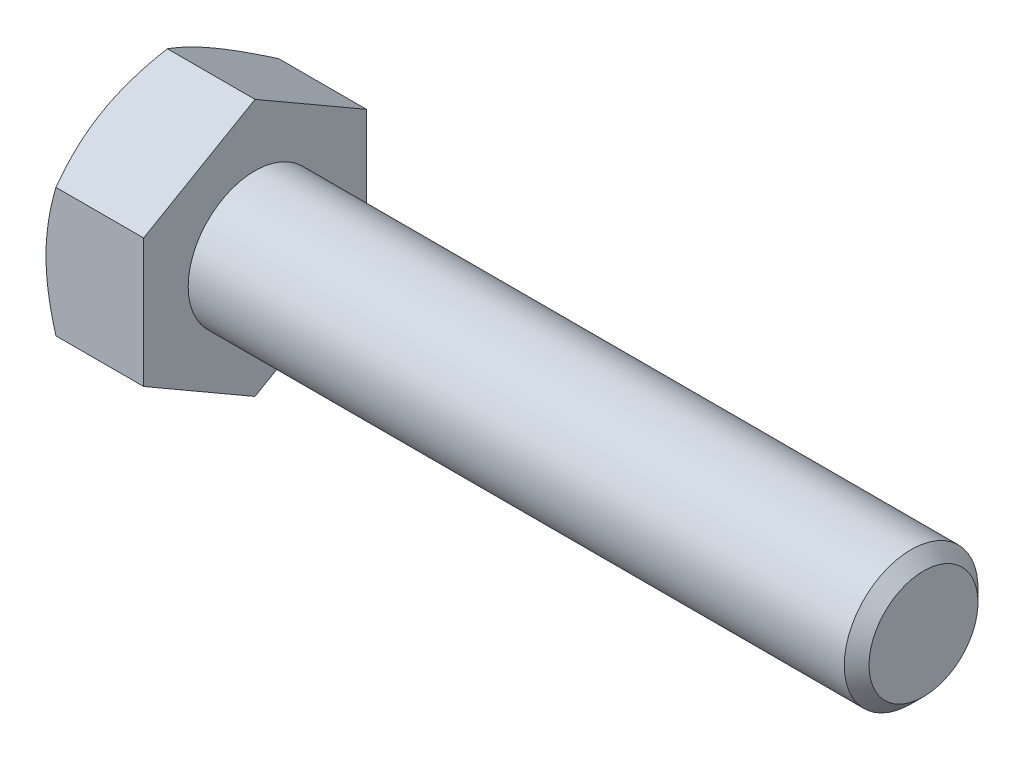
ISO-10303-21;
HEADER;
FILE_DESCRIPTION(('STEP AP214'),'2;1');
FILE_NAME('part.step','',(''),(''),'','','');
FILE_SCHEMA(('AUTOMOTIVE_DESIGN { 1 0 10303 214 1 1 1 1 }'));
ENDSEC;
DATA;
#1=APPLICATION_CONTEXT('core data for automotive mechanical design processes');
#2=APPLICATION_PROTOCOL_DEFINITION('international standard','automotive_design',2000,#1);
#3=PRODUCT_CONTEXT('',#1,'mechanical');
#4=PRODUCT('Part','Part','',(#3));
#5=PRODUCT_RELATED_PRODUCT_CATEGORY('part','',(#4));
#6=PRODUCT_DEFINITION_FORMATION('','',#4);
#7=PRODUCT_DEFINITION_CONTEXT('part definition',#1,'design');
#8=PRODUCT_DEFINITION('design','',#6,#7);
#9=PRODUCT_DEFINITION_SHAPE('','',#8);
#10=(LENGTH_UNIT() NAMED_UNIT(*) SI_UNIT(.MILLI.,.METRE.));
#11=(NAMED_UNIT(*) PLANE_ANGLE_UNIT() SI_UNIT($,.RADIAN.));
#12=(NAMED_UNIT(*) SI_UNIT($,.STERADIAN.) SOLID_ANGLE_UNIT());
#13=UNCERTAINTY_MEASURE_WITH_UNIT(LENGTH_MEASURE(1.E-05),#10,'distance_accuracy_value','');
#14=(GEOMETRIC_REPRESENTATION_CONTEXT(3) GLOBAL_UNCERTAINTY_ASSIGNED_CONTEXT((#13)) GLOBAL_UNIT_ASSIGNED_CONTEXT((#10,
#11,#12)) REPRESENTATION_CONTEXT('',''));
#15=CARTESIAN_POINT('',(0.,0.,0.));
#16=DIRECTION('',(0.,0.,1.));
#17=DIRECTION('',(1.,0.,0.));
#18=AXIS2_PLACEMENT_3D('',#15,#16,#17);
#19=CARTESIAN_POINT('',(0.,5.77350269189626,0.));
#20=DIRECTION('',(1.,0.,0.));
#21=DIRECTION('',(0.,0.,-1.));
#22=AXIS2_PLACEMENT_3D('',#19,#20,#21);
#23=PLANE('',#22);
#24=CARTESIAN_POINT('',(0.,0.,0.));
#25=DIRECTION('',(1.,0.,0.));
#26=DIRECTION('',(0.,1.,0.));
#27=AXIS2_PLACEMENT_3D('',#24,#25,#26);
#28=CIRCLE('',#27,4.99999999999545);
#29=CARTESIAN_POINT('',(1.31377912069731E-12,-4.33012701892023,-2.49999999999886));
#30=VERTEX_POINT('',#29);
#31=CARTESIAN_POINT('',(1.31276181687493E-12,0.,-4.99999999999773));
#32=VERTEX_POINT('',#31);
#33=EDGE_CURVE('E328',#30,#32,#28,.T.);
#34=ORIENTED_EDGE('',*,*,#33,.F.);
#35=CARTESIAN_POINT('',(0.,0.,0.));
#36=DIRECTION('',(1.,0.,0.));
#37=DIRECTION('',(0.,1.,0.));
#38=AXIS2_PLACEMENT_3D('',#35,#36,#37);
#39=CIRCLE('',#38,4.99999999999545);
#40=CARTESIAN_POINT('',(1.3112247506076E-12,-4.33012701892022,2.49999999999887));
#41=VERTEX_POINT('',#40);
#42=EDGE_CURVE('E327',#41,#30,#39,.T.);
#43=ORIENTED_EDGE('',*,*,#42,.F.);
#44=CARTESIAN_POINT('',(0.,0.,0.));
#45=DIRECTION('',(1.,0.,0.));
#46=DIRECTION('',(0.,1.,0.));
#47=AXIS2_PLACEMENT_3D('',#44,#45,#46);
#48=CIRCLE('',#47,4.99999999999545);
#49=CARTESIAN_POINT('',(1.31264503220733E-12,0.,4.99999999999773));
#50=VERTEX_POINT('',#49);
#51=EDGE_CURVE('E89',#50,#41,#48,.T.);
#52=ORIENTED_EDGE('',*,*,#51,.F.);
#53=CARTESIAN_POINT('',(0.,0.,0.));
#54=DIRECTION('',(1.,0.,0.));
#55=DIRECTION('',(0.,1.,0.));
#56=AXIS2_PLACEMENT_3D('',#53,#54,#55);
#57=CIRCLE('',#56,4.99999999999545);
#58=CARTESIAN_POINT('',(1.31333545798692E-12,4.33012701892022,2.49999999999887));
#59=VERTEX_POINT('',#58);
#60=EDGE_CURVE('E87',#59,#50,#57,.T.);
#61=ORIENTED_EDGE('',*,*,#60,.F.);
#62=CARTESIAN_POINT('',(0.,0.,0.));
#63=DIRECTION('',(1.,0.,0.));
#64=DIRECTION('',(0.,1.,0.));
#65=AXIS2_PLACEMENT_3D('',#62,#63,#64);
#66=CIRCLE('',#65,4.99999999999545);
#67=CARTESIAN_POINT('',(1.3127620276228E-12,4.33012701892022,-2.49999999999887));
#68=VERTEX_POINT('',#67);
#69=EDGE_CURVE('E20',#68,#59,#66,.T.);
#70=ORIENTED_EDGE('',*,*,#69,.F.);
#71=CARTESIAN_POINT('',(0.,0.,0.));
#72=DIRECTION('',(1.,0.,0.));
#73=DIRECTION('',(0.,1.,0.));
#74=AXIS2_PLACEMENT_3D('',#71,#72,#73);
#75=CIRCLE('',#74,4.99999999999545);
#76=EDGE_CURVE('E255',#32,#68,#75,.T.);
#77=ORIENTED_EDGE('',*,*,#76,.F.);
#78=EDGE_LOOP('',(#34,#43,#52,#61,#70,#77));
#79=FACE_BOUND('',#78,.T.);
#80=ADVANCED_FACE('F17',(#79),#23,.F.);
#81=CARTESIAN_POINT('',(0.449261479275265,0.,0.));
#82=DIRECTION('',(1.,0.,0.));
#83=DIRECTION('',(0.,1.,0.));
#84=AXIS2_PLACEMENT_3D('',#81,#82,#83);
#85=CONICAL_SURFACE('',#84,5.77814370797114,1.04719755118957);
#86=CARTESIAN_POINT('',(0.446581987394318,5.77350269189495,-2.27821175255341E-12));
#87=CARTESIAN_POINT('',(0.378731991613612,5.65601252710132,-0.203498934814473));
#88=CARTESIAN_POINT('',(0.316569549696801,5.53758145884731,-0.408627562225078));
#89=CARTESIAN_POINT('',(0.206947202600608,5.29967536418135,-0.820693005616809));
#90=CARTESIAN_POINT('',(0.159414596574626,5.18020863614853,-1.02761544838368));
#91=CARTESIAN_POINT('',(0.101052626368535,4.99988106812553,-1.33995195820484));
#92=CARTESIAN_POINT('',(0.0837477080387014,4.93954408647721,-1.44445867599509));
#93=CARTESIAN_POINT('',(0.0537925336807683,4.81858126545494,-1.65397242783251));
#94=CARTESIAN_POINT('',(0.0411421551416432,4.7579554337263,-1.75897944863763));
#95=CARTESIAN_POINT('',(0.0207183273002111,4.63619066509474,-1.96988221447936));
#96=CARTESIAN_POINT('',(0.0129696792605217,4.57505068020447,-2.0757797746833));
#97=CARTESIAN_POINT('',(0.00259979047148653,4.45265046787549,-2.28778316129432));
#98=CARTESIAN_POINT('',(-2.04348110579643E-05,4.39139021902687,-2.39388902478444));
#99=CARTESIAN_POINT('',(2.62566956059144E-12,4.33012701892219,-2.50000000000001));
#100=B_SPLINE_CURVE_WITH_KNOTS('',3,(#86,#87,#88,#89,#90,#91,#92,#93,#94,#95,#96,#97,#98,#99),
.UNSPECIFIED.,.F.,.F.,(4,2,2,2,2,2,4),(0.,0.734036658390386,1.46436443241443,1.83000749078048,
2.19564092445472,2.56310985866278,2.93065154716303),.UNSPECIFIED.);
#101=CARTESIAN_POINT('',(0.446581987394318,5.77350269189495,0.));
#102=VERTEX_POINT('',#101);
#103=EDGE_CURVE('E99',#102,#68,#100,.T.);
#104=ORIENTED_EDGE('',*,*,#103,.T.);
#105=ORIENTED_EDGE('',*,*,#69,.T.);
#106=CARTESIAN_POINT('',(2.62627457230914E-12,4.33012701892219,2.50000000000001));
#107=CARTESIAN_POINT('',(-2.04348110574818E-05,4.39139021902687,2.39388902478444));
#108=CARTESIAN_POINT('',(0.00259979047148711,4.45265046787549,2.28778316129432));
#109=CARTESIAN_POINT('',(0.0129696792605226,4.57505068020448,2.0757797746833));
#110=CARTESIAN_POINT('',(0.0207183273002123,4.63619066509475,1.96988221447936));
#111=CARTESIAN_POINT('',(0.0411421551416445,4.7579554337263,1.75897944863763));
#112=CARTESIAN_POINT('',(0.0537925336807697,4.81858126545494,1.65397242783251));
#113=CARTESIAN_POINT('',(0.0837477080387026,4.93954408647721,1.44445867599508));
#114=CARTESIAN_POINT('',(0.101052626368536,4.99988106812553,1.33995195820484));
#115=CARTESIAN_POINT('',(0.159414596574626,5.18020863614853,1.02761544838368));
#116=CARTESIAN_POINT('',(0.206947202600608,5.29967536418135,0.820693005616809));
#117=CARTESIAN_POINT('',(0.316569549696801,5.53758145884731,0.408627562225079));
#118=CARTESIAN_POINT('',(0.378731991613612,5.65601252710132,0.203498934814474));
#119=CARTESIAN_POINT('',(0.446581987394318,5.77350269189495,2.27899166758682E-12));
#120=B_SPLINE_CURVE_WITH_KNOTS('',3,(#106,#107,#108,#109,#110,#111,#112,#113,#114,#115,#116,
#117,#118,#119),.UNSPECIFIED.,.F.,.F.,(4,2,2,2,2,2,4),(0.,0.367541688500246,0.735010622708305,
1.10064405638255,1.4662871147486,2.19661488877264,2.93065154716302),.UNSPECIFIED.);
#121=EDGE_CURVE('E97',#59,#102,#120,.T.);
#122=ORIENTED_EDGE('',*,*,#121,.T.);
#123=EDGE_LOOP('',(#104,#105,#122));
#124=FACE_BOUND('',#123,.T.);
#125=ADVANCED_FACE('F95',(#124),#85,.T.);
#126=CARTESIAN_POINT('',(0.449261479275265,0.,0.));
#127=DIRECTION('',(1.,0.,0.));
#128=DIRECTION('',(0.,1.,0.));
#129=AXIS2_PLACEMENT_3D('',#126,#127,#128);
#130=CONICAL_SURFACE('',#129,5.77814370797114,1.04719755118957);
#131=CARTESIAN_POINT('',(0.446581987394315,2.88675134594944,4.99999999999772));
#132=CARTESIAN_POINT('',(0.378731991613609,3.00424151074306,4.79650106518553));
#133=CARTESIAN_POINT('',(0.316569549696799,3.12267257899707,4.59137243777492));
#134=CARTESIAN_POINT('',(0.206947202600606,3.36057867366303,4.1793069943832));
#135=CARTESIAN_POINT('',(0.159414596574625,3.48004540169586,3.97238455161633));
#136=CARTESIAN_POINT('',(0.101052626368535,3.66037296971886,3.66004804179516));
#137=CARTESIAN_POINT('',(0.0837477080387017,3.72070995136718,3.55554132400492));
#138=CARTESIAN_POINT('',(0.0537925336807689,3.84167277238944,3.3460275721675));
#139=CARTESIAN_POINT('',(0.0411421551416438,3.90229860411808,3.24102055136238));
#140=CARTESIAN_POINT('',(0.0207183273002118,4.02406337274964,3.03011778552065));
#141=CARTESIAN_POINT('',(0.0129696792605225,4.08520335763991,2.92422022531671));
#142=CARTESIAN_POINT('',(0.00259979047148732,4.20760356996889,2.71221683870569));
#143=CARTESIAN_POINT('',(-2.04348110572727E-05,4.26886381881751,2.60611097521557));
#144=CARTESIAN_POINT('',(2.62601554813398E-12,4.33012701892219,2.50000000000001));
#145=B_SPLINE_CURVE_WITH_KNOTS('',3,(#131,#132,#133,#134,#135,#136,#137,#138,#139,#140,#141,
#142,#143,#144),.UNSPECIFIED.,.F.,.F.,(4,2,2,2,2,2,4),(0.,0.734036658390382,1.46436443241442,
1.83000749078047,2.19564092445471,2.56310985866277,2.93065154716301),.UNSPECIFIED.);
#146=CARTESIAN_POINT('',(0.446581987394315,2.88675134594747,4.99999999999886));
#147=VERTEX_POINT('',#146);
#148=EDGE_CURVE('E102',#147,#59,#145,.T.);
#149=ORIENTED_EDGE('',*,*,#148,.T.);
#150=ORIENTED_EDGE('',*,*,#60,.T.);
#151=CARTESIAN_POINT('',(2.62529284589109E-12,0.,5.));
#152=CARTESIAN_POINT('',(-2.04348110587185E-05,0.122526400209358,5.));
#153=CARTESIAN_POINT('',(0.00259979047148596,0.245046897906593,5.));
#154=CARTESIAN_POINT('',(0.0129696792605216,0.489847322564566,5.));
#155=CARTESIAN_POINT('',(0.0207183273002114,0.612127292345108,5.));
#156=CARTESIAN_POINT('',(0.0411421551416433,0.855656829608219,5.));
#157=CARTESIAN_POINT('',(0.0537925336807679,0.976908493065498,5.));
#158=CARTESIAN_POINT('',(0.0837477080387005,1.21883413511003,5.));
#159=CARTESIAN_POINT('',(0.101052626368534,1.33950809840666,5.));
#160=CARTESIAN_POINT('',(0.159414596574625,1.70016323445266,5.));
#161=CARTESIAN_POINT('',(0.206947202600606,1.93909669051831,5.));
#162=CARTESIAN_POINT('',(0.316569549696798,2.41490887985023,5.));
#163=CARTESIAN_POINT('',(0.378731991613608,2.65177101635825,5.));
#164=CARTESIAN_POINT('',(0.446581987394315,2.88675134594549,5.));
#165=B_SPLINE_CURVE_WITH_KNOTS('',3,(#151,#152,#153,#154,#155,#156,#157,#158,#159,#160,#161,
#162,#163,#164),.UNSPECIFIED.,.F.,.F.,(4,2,2,2,2,2,4),(0.,0.367541688500244,0.735010622708302,
1.10064405638254,1.46628711474859,2.19661488877263,2.93065154716301),.UNSPECIFIED.);
#166=EDGE_CURVE('E105',#50,#147,#165,.T.);
#167=ORIENTED_EDGE('',*,*,#166,.T.);
#168=EDGE_LOOP('',(#149,#150,#167));
#169=FACE_BOUND('',#168,.T.);
#170=ADVANCED_FACE('F103',(#169),#130,.T.);
#171=CARTESIAN_POINT('',(0.449261479275265,0.,0.));
#172=DIRECTION('',(1.,0.,0.));
#173=DIRECTION('',(0.,1.,0.));
#174=AXIS2_PLACEMENT_3D('',#171,#172,#173);
#175=CONICAL_SURFACE('',#174,5.77814370797114,1.04719755118957);
#176=ORIENTED_EDGE('',*,*,#51,.T.);
#177=CARTESIAN_POINT('',(2.62242450390566E-12,-4.33012701892218,2.50000000000001));
#178=CARTESIAN_POINT('',(-2.04348110614389E-05,-4.2688638188175,2.60611097521557));
#179=CARTESIAN_POINT('',(0.00259979047148321,-4.20760356996889,2.71221683870569));
#180=CARTESIAN_POINT('',(0.0129696792605187,-4.0852033576399,2.92422022531671));
#181=CARTESIAN_POINT('',(0.0207183273002084,-4.02406337274963,3.03011778552065));
#182=CARTESIAN_POINT('',(0.0411421551416404,-3.90229860411807,3.24102055136238));
#183=CARTESIAN_POINT('',(0.0537925336807653,-3.84167277238943,3.3460275721675));
#184=CARTESIAN_POINT('',(0.0837477080386979,-3.72070995136717,3.55554132400492));
#185=CARTESIAN_POINT('',(0.101052626368531,-3.66037296971885,3.66004804179516));
#186=CARTESIAN_POINT('',(0.159414596574622,-3.48004540169585,3.97238455161633));
#187=CARTESIAN_POINT('',(0.206947202600603,-3.36057867366302,4.1793069943832));
#188=CARTESIAN_POINT('',(0.316569549696795,-3.12267257899706,4.59137243777492));
#189=CARTESIAN_POINT('',(0.378731991613605,-3.00424151074305,4.79650106518553));
#190=CARTESIAN_POINT('',(0.446581987394311,-2.88675134594943,4.99999999999772));
#191=B_SPLINE_CURVE_WITH_KNOTS('',3,(#177,#178,#179,#180,#181,#182,#183,#184,#185,#186,#187,
#188,#189,#190),.UNSPECIFIED.,.F.,.F.,(4,2,2,2,2,2,4),(0.,0.367541688500244,0.735010622708301,
1.10064405638254,1.46628711474859,2.19661488877263,2.93065154716301),.UNSPECIFIED.);
#192=CARTESIAN_POINT('',(0.446581987394311,-2.88675134594746,4.99999999999886));
#193=VERTEX_POINT('',#192);
#194=EDGE_CURVE('E174',#41,#193,#191,.T.);
#195=ORIENTED_EDGE('',*,*,#194,.T.);
#196=CARTESIAN_POINT('',(0.446581987394311,-2.88675134594548,5.));
#197=CARTESIAN_POINT('',(0.378731991613606,-2.65177101635824,5.));
#198=CARTESIAN_POINT('',(0.316569549696796,-2.41490887985022,5.));
#199=CARTESIAN_POINT('',(0.206947202600604,-1.93909669051831,5.));
#200=CARTESIAN_POINT('',(0.159414596574623,-1.70016323445266,5.));
#201=CARTESIAN_POINT('',(0.101052626368533,-1.33950809840666,5.));
#202=CARTESIAN_POINT('',(0.0837477080387002,-1.21883413511002,5.));
#203=CARTESIAN_POINT('',(0.0537925336807678,-0.976908493065495,5.));
#204=CARTESIAN_POINT('',(0.0411421551416427,-0.855656829608217,5.));
#205=CARTESIAN_POINT('',(0.0207183273002107,-0.612127292345106,5.));
#206=CARTESIAN_POINT('',(0.0129696792605213,-0.489847322564565,5.));
#207=CARTESIAN_POINT('',(0.00259979047148616,-0.245046897906593,5.));
#208=CARTESIAN_POINT('',(-2.04348110583341E-05,-0.122526400209359,5.));
#209=CARTESIAN_POINT('',(2.62529006441466E-12,0.,5.));
#210=B_SPLINE_CURVE_WITH_KNOTS('',3,(#196,#197,#198,#199,#200,#201,#202,#203,#204,#205,#206,
#207,#208,#209),.UNSPECIFIED.,.F.,.F.,(4,2,2,2,2,2,4),(0.,0.734036658390379,1.46436443241441,
1.83000749078047,2.1956409244547,2.56310985866276,2.930651547163),.UNSPECIFIED.);
#211=EDGE_CURVE('E148',#193,#50,#210,.T.);
#212=ORIENTED_EDGE('',*,*,#211,.T.);
#213=EDGE_LOOP('',(#176,#195,#212));
#214=FACE_BOUND('',#213,.T.);
#215=ADVANCED_FACE('F139',(#214),#175,.T.);
#216=CARTESIAN_POINT('',(0.449261479275265,0.,0.));
#217=DIRECTION('',(1.,0.,0.));
#218=DIRECTION('',(0.,1.,0.));
#219=AXIS2_PLACEMENT_3D('',#216,#217,#218);
#220=CONICAL_SURFACE('',#219,5.77814370797114,1.04719755118957);
#221=ORIENTED_EDGE('',*,*,#42,.T.);
#222=CARTESIAN_POINT('',(2.62692245925732E-12,-4.3301270189222,-2.5));
#223=CARTESIAN_POINT('',(-2.04348110562983E-05,-4.39139021902688,-2.39388902478443));
#224=CARTESIAN_POINT('',(0.00259979047148836,-4.45265046787549,-2.28778316129432));
#225=CARTESIAN_POINT('',(0.0129696792605236,-4.57505068020448,-2.07577977468329));
#226=CARTESIAN_POINT('',(0.020718327300213,-4.63619066509475,-1.96988221447935));
#227=CARTESIAN_POINT('',(0.0411421551416449,-4.75795543372631,-1.75897944863763));
#228=CARTESIAN_POINT('',(0.05379253368077,-4.81858126545495,-1.6539724278325));
#229=CARTESIAN_POINT('',(0.0837477080387027,-4.93954408647721,-1.44445867599508));
#230=CARTESIAN_POINT('',(0.101052626368536,-4.99988106812553,-1.33995195820484));
#231=CARTESIAN_POINT('',(0.159414596574626,-5.18020863614853,-1.02761544838367));
#232=CARTESIAN_POINT('',(0.206947202600608,-5.29967536418135,-0.820693005616806));
#233=CARTESIAN_POINT('',(0.3165695496968,-5.53758145884731,-0.408627562225077));
#234=CARTESIAN_POINT('',(0.37873199161361,-5.65601252710132,-0.203498934814473));
#235=CARTESIAN_POINT('',(0.446581987394316,-5.77350269189494,-2.2779459498124E-12));
#236=B_SPLINE_CURVE_WITH_KNOTS('',3,(#222,#223,#224,#225,#226,#227,#228,#229,#230,#231,#232,
#233,#234,#235),.UNSPECIFIED.,.F.,.F.,(4,2,2,2,2,2,4),(0.,0.367541688500244,0.735010622708302,
1.10064405638254,1.46628711474859,2.19661488877263,2.93065154716301),.UNSPECIFIED.);
#237=CARTESIAN_POINT('',(0.446581987394316,-5.77350269189494,0.));
#238=VERTEX_POINT('',#237);
#239=EDGE_CURVE('E302',#30,#238,#236,.T.);
#240=ORIENTED_EDGE('',*,*,#239,.T.);
#241=CARTESIAN_POINT('',(0.446581987394316,-5.77350269189494,2.27833276359788E-12));
#242=CARTESIAN_POINT('',(0.378731991613609,-5.65601252710132,0.203498934814475));
#243=CARTESIAN_POINT('',(0.316569549696798,-5.53758145884731,0.408627562225079));
#244=CARTESIAN_POINT('',(0.206947202600605,-5.29967536418135,0.820693005616809));
#245=CARTESIAN_POINT('',(0.159414596574624,-5.18020863614852,1.02761544838368));
#246=CARTESIAN_POINT('',(0.101052626368532,-4.99988106812552,1.33995195820485));
#247=CARTESIAN_POINT('',(0.0837477080386992,-4.9395440864772,1.44445867599509));
#248=CARTESIAN_POINT('',(0.0537925336807659,-4.81858126545494,1.65397242783251));
#249=CARTESIAN_POINT('',(0.0411421551416406,-4.7579554337263,1.75897944863763));
#250=CARTESIAN_POINT('',(0.0207183273002084,-4.63619066509474,1.96988221447936));
#251=CARTESIAN_POINT('',(0.0129696792605188,-4.57505068020447,2.0757797746833));
#252=CARTESIAN_POINT('',(0.00259979047148345,-4.45265046787548,2.28778316129433));
#253=CARTESIAN_POINT('',(-2.04348110611366E-05,-4.39139021902686,2.39388902478444));
#254=CARTESIAN_POINT('',(2.62242918875258E-12,-4.33012701892218,2.50000000000001));
#255=B_SPLINE_CURVE_WITH_KNOTS('',3,(#241,#242,#243,#244,#245,#246,#247,#248,#249,#250,#251,
#252,#253,#254),.UNSPECIFIED.,.F.,.F.,(4,2,2,2,2,2,4),(0.,0.734036658390386,1.46436443241443,
1.83000749078048,2.19564092445472,2.56310985866278,2.93065154716303),.UNSPECIFIED.);
#256=EDGE_CURVE('E169',#238,#41,#255,.T.);
#257=ORIENTED_EDGE('',*,*,#256,.T.);
#258=EDGE_LOOP('',(#221,#240,#257));
#259=FACE_BOUND('',#258,.T.);
#260=ADVANCED_FACE('F318',(#259),#220,.T.);
#261=CARTESIAN_POINT('',(0.449261479275265,0.,0.));
#262=DIRECTION('',(1.,0.,0.));
#263=DIRECTION('',(0.,1.,0.));
#264=AXIS2_PLACEMENT_3D('',#261,#262,#263);
#265=CONICAL_SURFACE('',#264,5.77814370797114,1.04719755118957);
#266=ORIENTED_EDGE('',*,*,#33,.T.);
#267=CARTESIAN_POINT('',(2.62554162158813E-12,0.,-5.));
#268=CARTESIAN_POINT('',(-2.04348110577706E-05,-0.122526400209367,-5.));
#269=CARTESIAN_POINT('',(0.00259979047148719,-0.24504689790661,-5.));
#270=CARTESIAN_POINT('',(0.0129696792605238,-0.4898473225646,-5.));
#271=CARTESIAN_POINT('',(0.0207183273002142,-0.61212729234515,-5.));
#272=CARTESIAN_POINT('',(0.0411421551416489,-0.855656829608277,-5.));
#273=CARTESIAN_POINT('',(0.0537925336807756,-0.976908493065564,-5.));
#274=CARTESIAN_POINT('',(0.0837477080387122,-1.21883413511011,-5.));
#275=CARTESIAN_POINT('',(0.101052626368547,-1.33950809840675,-5.));
#276=CARTESIAN_POINT('',(0.159414596574645,-1.70016323445278,-5.));
#277=CARTESIAN_POINT('',(0.206947202600632,-1.93909669051844,-5.));
#278=CARTESIAN_POINT('',(0.316569549696838,-2.41490887985039,-5.));
#279=CARTESIAN_POINT('',(0.378731991613655,-2.65177101635842,-5.));
#280=CARTESIAN_POINT('',(0.446581987394369,-2.88675134594568,-5.));
#281=B_SPLINE_CURVE_WITH_KNOTS('',3,(#267,#268,#269,#270,#271,#272,#273,#274,#275,#276,#277,
#278,#279,#280),.UNSPECIFIED.,.F.,.F.,(4,2,2,2,2,2,4),(0.,0.367541688500269,0.735010622708351,
1.10064405638261,1.46628711474869,2.19661488877278,2.93065154716321),.UNSPECIFIED.);
#282=CARTESIAN_POINT('',(0.446581987394308,-2.88675134594763,-4.99999999999875));
#283=VERTEX_POINT('',#282);
#284=EDGE_CURVE('E233',#32,#283,#281,.T.);
#285=ORIENTED_EDGE('',*,*,#284,.T.);
#286=CARTESIAN_POINT('',(0.446581987394246,-2.88675134594957,-4.99999999999751));
#287=CARTESIAN_POINT('',(0.37873199161355,-3.00424151074319,-4.79650106518533));
#288=CARTESIAN_POINT('',(0.316569549696749,-3.12267257899719,-4.59137243777474));
#289=CARTESIAN_POINT('',(0.206947202600573,-3.36057867366312,-4.17930699438305));
#290=CARTESIAN_POINT('',(0.159414596574599,-3.48004540169594,-3.9723845516162));
#291=CARTESIAN_POINT('',(0.101052626368518,-3.66037296971892,-3.66004804179506));
#292=CARTESIAN_POINT('',(0.0837477080386884,-3.72070995136724,-3.55554132400483));
#293=CARTESIAN_POINT('',(0.0537925336807608,-3.84167277238949,-3.34602757216742));
#294=CARTESIAN_POINT('',(0.0411421551416378,-3.90229860411813,-3.24102055136231));
#295=CARTESIAN_POINT('',(0.0207183273002092,-4.02406337274967,-3.0301177855206));
#296=CARTESIAN_POINT('',(0.012969679260521,-4.08520335763994,-2.92422022531667));
#297=CARTESIAN_POINT('',(0.00259979047148748,-4.20760356996891,-2.71221683870566));
#298=CARTESIAN_POINT('',(-2.04348110566343E-05,-4.26886381881752,-2.60611097521555));
#299=CARTESIAN_POINT('',(2.62691196451586E-12,-4.3301270189222,-2.5));
#300=B_SPLINE_CURVE_WITH_KNOTS('',3,(#286,#287,#288,#289,#290,#291,#292,#293,#294,#295,#296,
#297,#298,#299),.UNSPECIFIED.,.F.,.F.,(4,2,2,2,2,2,4),(0.,0.734036658390319,1.46436443241429,
1.83000749078032,2.19564092445452,2.56310985866255,2.93065154716276),.UNSPECIFIED.);
#301=EDGE_CURVE('E301',#283,#30,#300,.T.);
#302=ORIENTED_EDGE('',*,*,#301,.T.);
#303=EDGE_LOOP('',(#266,#285,#302));
#304=FACE_BOUND('',#303,.T.);
#305=ADVANCED_FACE('F247',(#304),#265,.T.);
#306=CARTESIAN_POINT('',(0.449261479275265,0.,0.));
#307=DIRECTION('',(1.,0.,0.));
#308=DIRECTION('',(0.,1.,0.));
#309=AXIS2_PLACEMENT_3D('',#306,#307,#308);
#310=CONICAL_SURFACE('',#309,5.77814370797114,1.04719755118957);
#311=CARTESIAN_POINT('',(0.446581987394314,2.88675134594549,-5.));
#312=CARTESIAN_POINT('',(0.378731991613607,2.65177101635825,-5.));
#313=CARTESIAN_POINT('',(0.316569549696797,2.41490887985023,-5.));
#314=CARTESIAN_POINT('',(0.206947202600605,1.93909669051831,-5.));
#315=CARTESIAN_POINT('',(0.159414596574625,1.70016323445266,-5.));
#316=CARTESIAN_POINT('',(0.101052626368534,1.33950809840666,-5.));
#317=CARTESIAN_POINT('',(0.0837477080387007,1.21883413511003,-5.));
#318=CARTESIAN_POINT('',(0.0537925336807681,0.976908493065498,-5.));
#319=CARTESIAN_POINT('',(0.0411421551416434,0.855656829608219,-5.));
#320=CARTESIAN_POINT('',(0.0207183273002116,0.612127292345108,-5.));
#321=CARTESIAN_POINT('',(0.0129696792605218,0.489847322564566,-5.));
#322=CARTESIAN_POINT('',(0.00259979047148617,0.245046897906593,-5.));
#323=CARTESIAN_POINT('',(-2.04348110584997E-05,0.122526400209358,-5.));
#324=CARTESIAN_POINT('',(2.62552363374986E-12,0.,-5.));
#325=B_SPLINE_CURVE_WITH_KNOTS('',3,(#311,#312,#313,#314,#315,#316,#317,#318,#319,#320,#321,
#322,#323,#324),.UNSPECIFIED.,.F.,.F.,(4,2,2,2,2,2,4),(0.,0.734036658390381,1.46436443241442,
1.83000749078047,2.19564092445471,2.56310985866277,2.93065154716301),.UNSPECIFIED.);
#326=CARTESIAN_POINT('',(0.446581987394694,2.88675134594878,-4.99999999999886));
#327=VERTEX_POINT('',#326);
#328=EDGE_CURVE('E225',#327,#32,#325,.T.);
#329=ORIENTED_EDGE('',*,*,#328,.T.);
#330=ORIENTED_EDGE('',*,*,#76,.T.);
#331=CARTESIAN_POINT('',(2.62516360106827E-12,4.33012701892219,-2.50000000000001));
#332=CARTESIAN_POINT('',(-2.04348110586845E-05,4.26886381881751,-2.60611097521557));
#333=CARTESIAN_POINT('',(0.00259979047148591,4.20760356996889,-2.71221683870569));
#334=CARTESIAN_POINT('',(0.0129696792605213,4.08520335763991,-2.92422022531671));
#335=CARTESIAN_POINT('',(0.0207183273002109,4.02406337274963,-3.03011778552065));
#336=CARTESIAN_POINT('',(0.0411421551416428,3.90229860411808,-3.24102055136238));
#337=CARTESIAN_POINT('',(0.0537925336807676,3.84167277238944,-3.3460275721675));
#338=CARTESIAN_POINT('',(0.0837477080387004,3.72070995136717,-3.55554132400492));
#339=CARTESIAN_POINT('',(0.101052626368534,3.66037296971886,-3.66004804179516));
#340=CARTESIAN_POINT('',(0.159414596574625,3.48004540169586,-3.97238455161633));
#341=CARTESIAN_POINT('',(0.206947202600605,3.36057867366303,-4.1793069943832));
#342=CARTESIAN_POINT('',(0.316569549696797,3.12267257899707,-4.59137243777492));
#343=CARTESIAN_POINT('',(0.378731991613607,3.00424151074306,-4.79650106518553));
#344=CARTESIAN_POINT('',(0.446581987394314,2.88675134594944,-4.99999999999772));
#345=B_SPLINE_CURVE_WITH_KNOTS('',3,(#331,#332,#333,#334,#335,#336,#337,#338,#339,#340,#341,
#342,#343,#344),.UNSPECIFIED.,.F.,.F.,(4,2,2,2,2,2,4),(0.,0.367541688500244,0.735010622708301,
1.10064405638254,1.46628711474859,2.19661488877263,2.93065154716301),.UNSPECIFIED.);
#346=EDGE_CURVE('E115',#68,#327,#345,.T.);
#347=ORIENTED_EDGE('',*,*,#346,.T.);
#348=EDGE_LOOP('',(#329,#330,#347));
#349=FACE_BOUND('',#348,.T.);
#350=ADVANCED_FACE('F242',(#349),#310,.T.);
#351=CARTESIAN_POINT('',(34.38,0.,0.));
#352=DIRECTION('',(-1.,0.,0.));
#353=DIRECTION('',(0.,0.,1.));
#354=AXIS2_PLACEMENT_3D('',#351,#352,#353);
#355=PLANE('',#354);
#356=CARTESIAN_POINT('',(34.3799999999987,0.,0.));
#357=DIRECTION('',(-1.,0.,0.));
#358=DIRECTION('',(0.,0.,1.));
#359=AXIS2_PLACEMENT_3D('',#356,#357,#358);
#360=CIRCLE('',#359,2.44550000002164);
#361=CARTESIAN_POINT('',(34.3799999999987,0.,2.44550000002164));
#362=VERTEX_POINT('',#361);
#363=EDGE_CURVE('E196',#362,#362,#360,.T.);
#364=ORIENTED_EDGE('',*,*,#363,.F.);
#365=EDGE_LOOP('',(#364));
#366=FACE_BOUND('',#365,.T.);
#367=ADVANCED_FACE('F246',(#366),#355,.F.);
#368=CARTESIAN_POINT('',(4.38,2.88675134594812,-5.));
#369=DIRECTION('',(0.,-0.866025403784438,0.500000000000001));
#370=DIRECTION('',(0.,-0.500000000000001,-0.866025403784438));
#371=AXIS2_PLACEMENT_3D('',#368,#369,#370);
#372=PLANE('',#371);
#373=DIRECTION('',(1.,0.,0.));
#374=VECTOR('',#373,1.);
#375=CARTESIAN_POINT('',(4.38,5.77350269189626,0.));
#376=LINE('',#375,#374);
#377=CARTESIAN_POINT('',(4.38,5.77350269189626,0.));
#378=VERTEX_POINT('',#377);
#379=EDGE_CURVE('E108',#102,#378,#376,.T.);
#380=ORIENTED_EDGE('',*,*,#379,.T.);
#381=DIRECTION('',(0.,0.500000000000001,0.866025403784438));
#382=VECTOR('',#381,1.);
#383=CARTESIAN_POINT('',(4.38,2.88675134594812,-5.));
#384=LINE('',#383,#382);
#385=CARTESIAN_POINT('',(4.38,2.88675134594812,-5.));
#386=VERTEX_POINT('',#385);
#387=EDGE_CURVE('E192',#386,#378,#384,.T.);
#388=ORIENTED_EDGE('',*,*,#387,.F.);
#389=DIRECTION('',(1.,0.,0.));
#390=VECTOR('',#389,1.);
#391=CARTESIAN_POINT('',(4.38,2.88675134594812,-5.));
#392=LINE('',#391,#390);
#393=EDGE_CURVE('E232',#386,#327,#392,.F.);
#394=ORIENTED_EDGE('',*,*,#393,.T.);
#395=ORIENTED_EDGE('',*,*,#346,.F.);
#396=ORIENTED_EDGE('',*,*,#103,.F.);
#397=EDGE_LOOP('',(#380,#388,#394,#395,#396));
#398=FACE_BOUND('',#397,.T.);
#399=ADVANCED_FACE('F257',(#398),#372,.F.);
#400=CARTESIAN_POINT('',(4.38,5.77350269189626,0.));
#401=DIRECTION('',(0.,-0.866025403784438,-0.500000000000001));
#402=DIRECTION('',(0.,0.500000000000001,-0.866025403784438));
#403=AXIS2_PLACEMENT_3D('',#400,#401,#402);
#404=PLANE('',#403);
#405=DIRECTION('',(1.,0.,0.));
#406=VECTOR('',#405,1.);
#407=CARTESIAN_POINT('',(4.38,2.88675134594813,5.));
#408=LINE('',#407,#406);
#409=CARTESIAN_POINT('',(4.38,2.88675134594813,5.));
#410=VERTEX_POINT('',#409);
#411=EDGE_CURVE('E147',#147,#410,#408,.T.);
#412=ORIENTED_EDGE('',*,*,#411,.T.);
#413=DIRECTION('',(0.,-0.500000000000001,0.866025403784438));
#414=VECTOR('',#413,1.);
#415=CARTESIAN_POINT('',(4.38,5.77350269189626,0.));
#416=LINE('',#415,#414);
#417=EDGE_CURVE('E195',#378,#410,#416,.T.);
#418=ORIENTED_EDGE('',*,*,#417,.F.);
#419=ORIENTED_EDGE('',*,*,#379,.F.);
#420=ORIENTED_EDGE('',*,*,#121,.F.);
#421=ORIENTED_EDGE('',*,*,#148,.F.);
#422=EDGE_LOOP('',(#412,#418,#419,#420,#421));
#423=FACE_BOUND('',#422,.T.);
#424=ADVANCED_FACE('F111',(#423),#404,.F.);
#425=CARTESIAN_POINT('',(4.38,2.88675134594813,5.));
#426=DIRECTION('',(0.,0.,-1.));
#427=DIRECTION('',(0.,1.,0.));
#428=AXIS2_PLACEMENT_3D('',#425,#426,#427);
#429=PLANE('',#428);
#430=DIRECTION('',(1.,0.,0.));
#431=VECTOR('',#430,1.);
#432=CARTESIAN_POINT('',(4.38,-2.88675134594812,5.));
#433=LINE('',#432,#431);
#434=CARTESIAN_POINT('',(4.38,-2.88675134594812,5.));
#435=VERTEX_POINT('',#434);
#436=EDGE_CURVE('E178',#193,#435,#433,.T.);
#437=ORIENTED_EDGE('',*,*,#436,.T.);
#438=DIRECTION('',(0.,1.,0.));
#439=VECTOR('',#438,1.);
#440=CARTESIAN_POINT('',(4.38,5.77350269189626,5.));
#441=LINE('',#440,#439);
#442=EDGE_CURVE('E212',#410,#435,#441,.F.);
#443=ORIENTED_EDGE('',*,*,#442,.F.);
#444=ORIENTED_EDGE('',*,*,#411,.F.);
#445=ORIENTED_EDGE('',*,*,#166,.F.);
#446=ORIENTED_EDGE('',*,*,#211,.F.);
#447=EDGE_LOOP('',(#437,#443,#444,#445,#446));
#448=FACE_BOUND('',#447,.T.);
#449=ADVANCED_FACE('F153',(#448),#429,.F.);
#450=CARTESIAN_POINT('',(4.38,-5.77350269189626,0.));
#451=DIRECTION('',(0.,0.866025403784438,-0.500000000000002));
#452=DIRECTION('',(0.,0.500000000000002,0.866025403784438));
#453=AXIS2_PLACEMENT_3D('',#450,#451,#452);
#454=PLANE('',#453);
#455=DIRECTION('',(1.,0.,0.));
#456=VECTOR('',#455,1.);
#457=CARTESIAN_POINT('',(4.38,-5.77350269189626,0.));
#458=LINE('',#457,#456);
#459=CARTESIAN_POINT('',(4.38,-5.77350269189626,0.));
#460=VERTEX_POINT('',#459);
#461=EDGE_CURVE('E299',#238,#460,#458,.T.);
#462=ORIENTED_EDGE('',*,*,#461,.T.);
#463=DIRECTION('',(0.,-0.500000000000002,-0.866025403784438));
#464=VECTOR('',#463,1.);
#465=CARTESIAN_POINT('',(4.38,-2.88675134594812,5.));
#466=LINE('',#465,#464);
#467=EDGE_CURVE('E207',#435,#460,#466,.T.);
#468=ORIENTED_EDGE('',*,*,#467,.F.);
#469=ORIENTED_EDGE('',*,*,#436,.F.);
#470=ORIENTED_EDGE('',*,*,#194,.F.);
#471=ORIENTED_EDGE('',*,*,#256,.F.);
#472=EDGE_LOOP('',(#462,#468,#469,#470,#471));
#473=FACE_BOUND('',#472,.T.);
#474=ADVANCED_FACE('F157',(#473),#454,.F.);
#475=CARTESIAN_POINT('',(4.38,-2.88675134594813,-5.));
#476=DIRECTION('',(0.,0.866025403784439,0.5));
#477=DIRECTION('',(0.,-0.5,0.866025403784439));
#478=AXIS2_PLACEMENT_3D('',#475,#476,#477);
#479=PLANE('',#478);
#480=DIRECTION('',(1.,0.,0.));
#481=VECTOR('',#480,1.);
#482=CARTESIAN_POINT('',(4.38,-2.88675134594852,-5.));
#483=LINE('',#482,#481);
#484=CARTESIAN_POINT('',(4.38,-2.88675134594837,-5.));
#485=VERTEX_POINT('',#484);
#486=EDGE_CURVE('E35',#283,#485,#483,.T.);
#487=ORIENTED_EDGE('',*,*,#486,.T.);
#488=DIRECTION('',(0.,0.499999999999999,-0.866025403784439));
#489=VECTOR('',#488,1.);
#490=CARTESIAN_POINT('',(4.38,-5.77350269189626,0.));
#491=LINE('',#490,#489);
#492=EDGE_CURVE('E202',#460,#485,#491,.T.);
#493=ORIENTED_EDGE('',*,*,#492,.F.);
#494=ORIENTED_EDGE('',*,*,#461,.F.);
#495=ORIENTED_EDGE('',*,*,#239,.F.);
#496=ORIENTED_EDGE('',*,*,#301,.F.);
#497=EDGE_LOOP('',(#487,#493,#494,#495,#496));
#498=FACE_BOUND('',#497,.T.);
#499=ADVANCED_FACE('F163',(#498),#479,.F.);
#500=CARTESIAN_POINT('',(4.38,2.88675134594812,-5.));
#501=DIRECTION('',(0.,0.,1.));
#502=DIRECTION('',(1.,0.,0.));
#503=AXIS2_PLACEMENT_3D('',#500,#501,#502);
#504=PLANE('',#503);
#505=ORIENTED_EDGE('',*,*,#393,.F.);
#506=DIRECTION('',(0.,1.,0.));
#507=VECTOR('',#506,1.);
#508=CARTESIAN_POINT('',(4.38,5.77350269189626,-5.));
#509=LINE('',#508,#507);
#510=EDGE_CURVE('E199',#485,#386,#509,.T.);
#511=ORIENTED_EDGE('',*,*,#510,.F.);
#512=ORIENTED_EDGE('',*,*,#486,.F.);
#513=ORIENTED_EDGE('',*,*,#284,.F.);
#514=ORIENTED_EDGE('',*,*,#328,.F.);
#515=EDGE_LOOP('',(#505,#511,#512,#513,#514));
#516=FACE_BOUND('',#515,.T.);
#517=ADVANCED_FACE('F239',(#516),#504,.F.);
#518=CARTESIAN_POINT('',(33.8255000000345,0.,0.));
#519=DIRECTION('',(-1.,0.,0.));
#520=DIRECTION('',(0.,0.,1.));
#521=AXIS2_PLACEMENT_3D('',#518,#519,#520);
#522=CONICAL_SURFACE('',#521,2.99999999992906,0.785398163346192);
#523=CARTESIAN_POINT('',(33.8255,0.,0.));
#524=DIRECTION('',(-1.,0.,0.));
#525=DIRECTION('',(0.,0.,1.));
#526=AXIS2_PLACEMENT_3D('',#523,#524,#525);
#527=CIRCLE('',#526,3.);
#528=CARTESIAN_POINT('',(33.8255,0.,3.));
#529=VERTEX_POINT('',#528);
#530=EDGE_CURVE('E26',#529,#529,#527,.T.);
#531=ORIENTED_EDGE('',*,*,#530,.F.);
#532=EDGE_LOOP('',(#531));
#533=FACE_BOUND('',#532,.T.);
#534=ORIENTED_EDGE('',*,*,#363,.T.);
#535=EDGE_LOOP('',(#534));
#536=FACE_BOUND('',#535,.T.);
#537=ADVANCED_FACE('F276',(#533,#536),#522,.T.);
#538=CARTESIAN_POINT('',(4.38,5.77350269189626,0.));
#539=DIRECTION('',(1.,0.,0.));
#540=DIRECTION('',(0.,0.,-1.));
#541=AXIS2_PLACEMENT_3D('',#538,#539,#540);
#542=PLANE('',#541);
#543=CARTESIAN_POINT('',(4.38,0.,0.));
#544=DIRECTION('',(-1.,0.,0.));
#545=DIRECTION('',(0.,0.,1.));
#546=AXIS2_PLACEMENT_3D('',#543,#544,#545);
#547=CIRCLE('',#546,3.);
#548=CARTESIAN_POINT('',(4.38,0.,3.));
#549=VERTEX_POINT('',#548);
#550=EDGE_CURVE('E11',#549,#549,#547,.F.);
#551=ORIENTED_EDGE('',*,*,#550,.F.);
#552=EDGE_LOOP('',(#551));
#553=FACE_BOUND('',#552,.T.);
#554=ORIENTED_EDGE('',*,*,#492,.T.);
#555=ORIENTED_EDGE('',*,*,#510,.T.);
#556=ORIENTED_EDGE('',*,*,#387,.T.);
#557=ORIENTED_EDGE('',*,*,#417,.T.);
#558=ORIENTED_EDGE('',*,*,#442,.T.);
#559=ORIENTED_EDGE('',*,*,#467,.T.);
#560=EDGE_LOOP('',(#554,#555,#556,#557,#558,#559));
#561=FACE_BOUND('',#560,.T.);
#562=ADVANCED_FACE('F270',(#553,#561),#542,.T.);
#563=CARTESIAN_POINT('',(0.,0.,0.));
#564=DIRECTION('',(-1.,0.,0.));
#565=DIRECTION('',(0.,0.,1.));
#566=AXIS2_PLACEMENT_3D('',#563,#564,#565);
#567=CYLINDRICAL_SURFACE('',#566,3.);
#568=ORIENTED_EDGE('',*,*,#550,.T.);
#569=EDGE_LOOP('',(#568));
#570=FACE_BOUND('',#569,.T.);
#571=ORIENTED_EDGE('',*,*,#530,.T.);
#572=EDGE_LOOP('',(#571));
#573=FACE_BOUND('',#572,.T.);
#574=ADVANCED_FACE('F268',(#570,#573),#567,.T.);
#575=CLOSED_SHELL('',(#80,#125,#170,#215,#260,#305,#350,#367,#399,#424,#449,#474,#499,#517,#537,
#562,#574));
#576=MANIFOLD_SOLID_BREP('B1',#575);
#577=ADVANCED_BREP_SHAPE_REPRESENTATION('',(#18,#576),#14);
#578=SHAPE_DEFINITION_REPRESENTATION(#9,#577);
ENDSEC;
END-ISO-10303-21;
